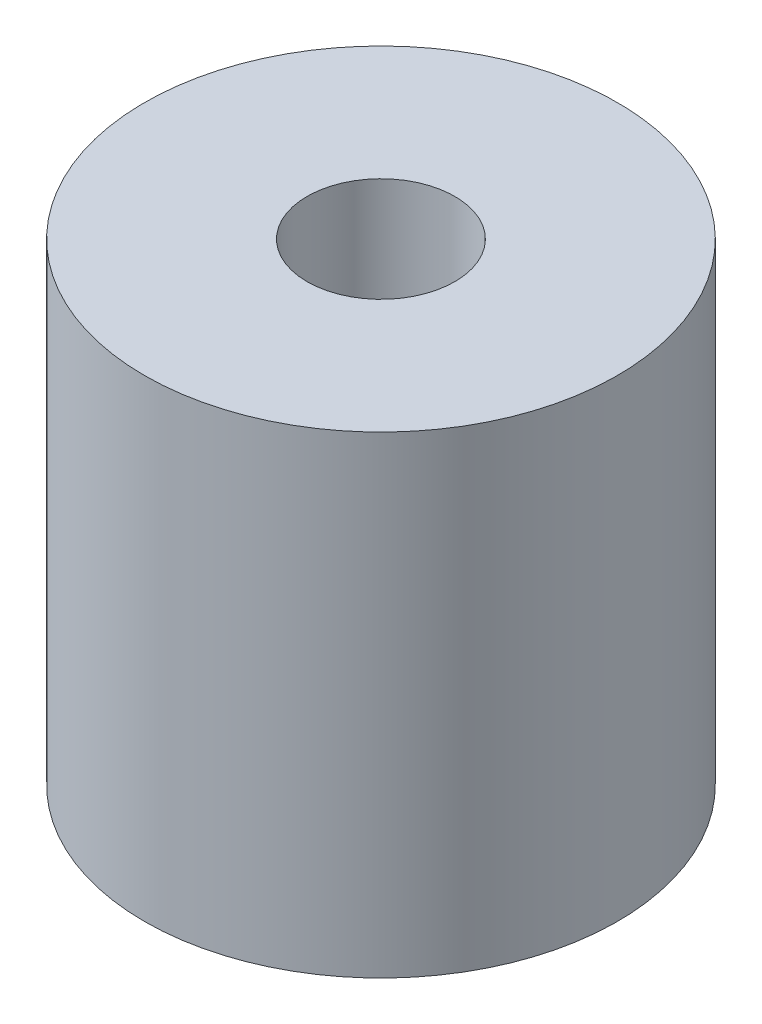
ISO-10303-21;
HEADER;
FILE_DESCRIPTION(('STEP AP214'),'2;1');
FILE_NAME('part.step','',(''),(''),'','','');
FILE_SCHEMA(('AUTOMOTIVE_DESIGN { 1 0 10303 214 1 1 1 1 }'));
ENDSEC;
DATA;
#1=APPLICATION_CONTEXT('core data for automotive mechanical design processes');
#2=APPLICATION_PROTOCOL_DEFINITION('international standard','automotive_design',2000,#1);
#3=PRODUCT_CONTEXT('',#1,'mechanical');
#4=PRODUCT('Part','Part','',(#3));
#5=PRODUCT_RELATED_PRODUCT_CATEGORY('part','',(#4));
#6=PRODUCT_DEFINITION_FORMATION('','',#4);
#7=PRODUCT_DEFINITION_CONTEXT('part definition',#1,'design');
#8=PRODUCT_DEFINITION('design','',#6,#7);
#9=PRODUCT_DEFINITION_SHAPE('','',#8);
#10=(LENGTH_UNIT() NAMED_UNIT(*) SI_UNIT(.MILLI.,.METRE.));
#11=(NAMED_UNIT(*) PLANE_ANGLE_UNIT() SI_UNIT($,.RADIAN.));
#12=(NAMED_UNIT(*) SI_UNIT($,.STERADIAN.) SOLID_ANGLE_UNIT());
#13=UNCERTAINTY_MEASURE_WITH_UNIT(LENGTH_MEASURE(1.E-05),#10,'distance_accuracy_value','');
#14=(GEOMETRIC_REPRESENTATION_CONTEXT(3) GLOBAL_UNCERTAINTY_ASSIGNED_CONTEXT((#13)) GLOBAL_UNIT_ASSIGNED_CONTEXT((#10,
#11,#12)) REPRESENTATION_CONTEXT('',''));
#15=CARTESIAN_POINT('',(0.,0.,0.));
#16=DIRECTION('',(0.,0.,1.));
#17=DIRECTION('',(1.,0.,0.));
#18=AXIS2_PLACEMENT_3D('',#15,#16,#17);
#19=CARTESIAN_POINT('',(0.,16.,0.));
#20=DIRECTION('',(0.,1.,0.));
#21=DIRECTION('',(0.,0.,1.));
#22=AXIS2_PLACEMENT_3D('',#19,#20,#21);
#23=PLANE('',#22);
#24=CARTESIAN_POINT('',(0.,16.,0.));
#25=DIRECTION('',(0.,1.,0.));
#26=DIRECTION('',(0.,0.,1.));
#27=AXIS2_PLACEMENT_3D('',#24,#25,#26);
#28=CIRCLE('',#27,8.);
#29=CARTESIAN_POINT('',(0.,16.,8.));
#30=VERTEX_POINT('',#29);
#31=EDGE_CURVE('E10',#30,#30,#28,.T.);
#32=ORIENTED_EDGE('',*,*,#31,.T.);
#33=EDGE_LOOP('',(#32));
#34=FACE_BOUND('',#33,.T.);
#35=CARTESIAN_POINT('',(0.,16.,0.));
#36=DIRECTION('',(0.,1.,0.));
#37=DIRECTION('',(0.,0.,1.));
#38=AXIS2_PLACEMENT_3D('',#35,#36,#37);
#39=CIRCLE('',#38,2.5);
#40=CARTESIAN_POINT('',(0.,16.,2.5));
#41=VERTEX_POINT('',#40);
#42=EDGE_CURVE('E54',#41,#41,#39,.T.);
#43=ORIENTED_EDGE('',*,*,#42,.F.);
#44=EDGE_LOOP('',(#43));
#45=FACE_BOUND('',#44,.T.);
#46=ADVANCED_FACE('F41',(#34,#45),#23,.T.);
#47=CARTESIAN_POINT('',(0.,0.,0.));
#48=DIRECTION('',(0.,1.,0.));
#49=DIRECTION('',(0.,0.,1.));
#50=AXIS2_PLACEMENT_3D('',#47,#48,#49);
#51=PLANE('',#50);
#52=CARTESIAN_POINT('',(0.,0.,0.));
#53=DIRECTION('',(0.,1.,0.));
#54=DIRECTION('',(0.,0.,1.));
#55=AXIS2_PLACEMENT_3D('',#52,#53,#54);
#56=CIRCLE('',#55,8.);
#57=CARTESIAN_POINT('',(0.,0.,8.));
#58=VERTEX_POINT('',#57);
#59=EDGE_CURVE('E45',#58,#58,#56,.T.);
#60=ORIENTED_EDGE('',*,*,#59,.F.);
#61=EDGE_LOOP('',(#60));
#62=FACE_BOUND('',#61,.T.);
#63=CARTESIAN_POINT('',(0.,0.,0.));
#64=DIRECTION('',(0.,1.,0.));
#65=DIRECTION('',(0.,0.,1.));
#66=AXIS2_PLACEMENT_3D('',#63,#64,#65);
#67=CIRCLE('',#66,2.5);
#68=CARTESIAN_POINT('',(0.,0.,2.5));
#69=VERTEX_POINT('',#68);
#70=EDGE_CURVE('E56',#69,#69,#67,.T.);
#71=ORIENTED_EDGE('',*,*,#70,.T.);
#72=EDGE_LOOP('',(#71));
#73=FACE_BOUND('',#72,.T.);
#74=ADVANCED_FACE('F68',(#62,#73),#51,.F.);
#75=CARTESIAN_POINT('',(0.,16.,0.));
#76=DIRECTION('',(0.,-1.,0.));
#77=DIRECTION('',(0.,0.,-1.));
#78=AXIS2_PLACEMENT_3D('',#75,#76,#77);
#79=CYLINDRICAL_SURFACE('',#78,8.);
#80=ORIENTED_EDGE('',*,*,#31,.F.);
#81=EDGE_LOOP('',(#80));
#82=FACE_BOUND('',#81,.T.);
#83=ORIENTED_EDGE('',*,*,#59,.T.);
#84=EDGE_LOOP('',(#83));
#85=FACE_BOUND('',#84,.T.);
#86=ADVANCED_FACE('F43',(#82,#85),#79,.T.);
#87=CARTESIAN_POINT('',(0.,16.,0.));
#88=DIRECTION('',(0.,-1.,0.));
#89=DIRECTION('',(0.,0.,-1.));
#90=AXIS2_PLACEMENT_3D('',#87,#88,#89);
#91=CYLINDRICAL_SURFACE('',#90,2.5);
#92=ORIENTED_EDGE('',*,*,#42,.T.);
#93=EDGE_LOOP('',(#92));
#94=FACE_BOUND('',#93,.T.);
#95=ORIENTED_EDGE('',*,*,#70,.F.);
#96=EDGE_LOOP('',(#95));
#97=FACE_BOUND('',#96,.T.);
#98=ADVANCED_FACE('F64',(#94,#97),#91,.F.);
#99=CLOSED_SHELL('',(#46,#74,#86,#98));
#100=MANIFOLD_SOLID_BREP('B2',#99);
#101=ADVANCED_BREP_SHAPE_REPRESENTATION('',(#18,#100),#14);
#102=SHAPE_DEFINITION_REPRESENTATION(#9,#101);
ENDSEC;
END-ISO-10303-21;
